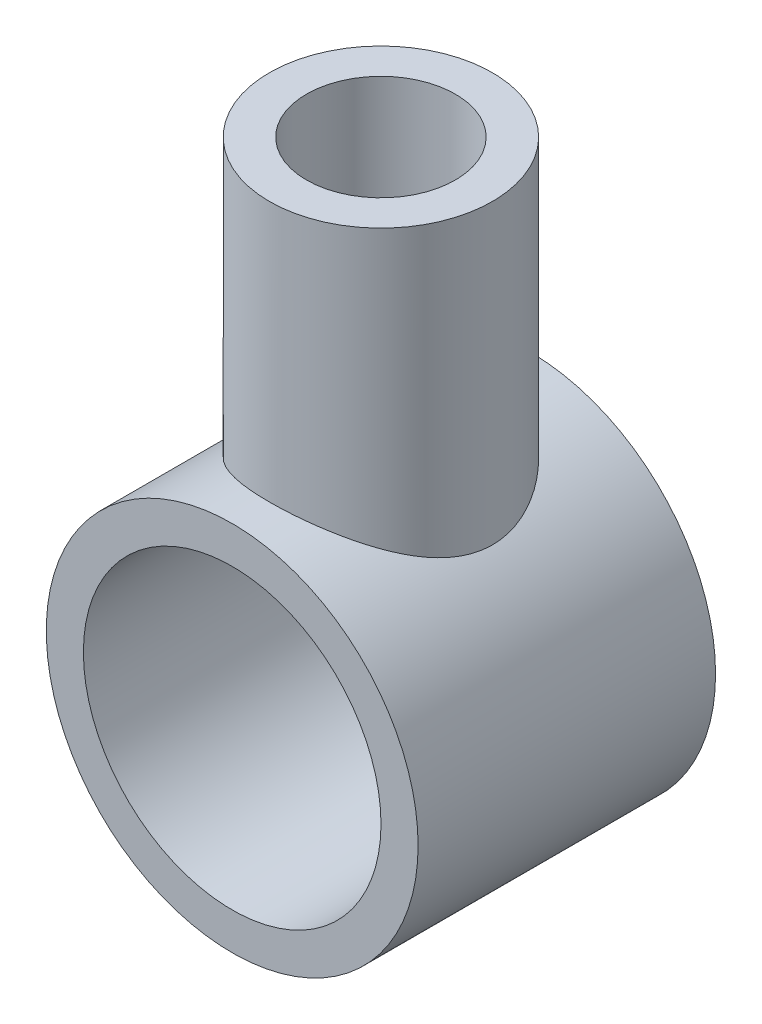
ISO-10303-21;
HEADER;
FILE_DESCRIPTION(('STEP AP214'),'2;1');
FILE_NAME('part.step','',(''),(''),'','','');
FILE_SCHEMA(('AUTOMOTIVE_DESIGN { 1 0 10303 214 1 1 1 1 }'));
ENDSEC;
DATA;
#1=APPLICATION_CONTEXT('core data for automotive mechanical design processes');
#2=APPLICATION_PROTOCOL_DEFINITION('international standard','automotive_design',2000,#1);
#3=PRODUCT_CONTEXT('',#1,'mechanical');
#4=PRODUCT('Part','Part','',(#3));
#5=PRODUCT_RELATED_PRODUCT_CATEGORY('part','',(#4));
#6=PRODUCT_DEFINITION_FORMATION('','',#4);
#7=PRODUCT_DEFINITION_CONTEXT('part definition',#1,'design');
#8=PRODUCT_DEFINITION('design','',#6,#7);
#9=PRODUCT_DEFINITION_SHAPE('','',#8);
#10=(LENGTH_UNIT() NAMED_UNIT(*) SI_UNIT(.MILLI.,.METRE.));
#11=(NAMED_UNIT(*) PLANE_ANGLE_UNIT() SI_UNIT($,.RADIAN.));
#12=(NAMED_UNIT(*) SI_UNIT($,.STERADIAN.) SOLID_ANGLE_UNIT());
#13=UNCERTAINTY_MEASURE_WITH_UNIT(LENGTH_MEASURE(1.E-05),#10,'distance_accuracy_value','');
#14=(GEOMETRIC_REPRESENTATION_CONTEXT(3) GLOBAL_UNCERTAINTY_ASSIGNED_CONTEXT((#13)) GLOBAL_UNIT_ASSIGNED_CONTEXT((#10,
#11,#12)) REPRESENTATION_CONTEXT('',''));
#15=CARTESIAN_POINT('',(0.,0.,0.));
#16=DIRECTION('',(0.,0.,1.));
#17=DIRECTION('',(1.,0.,0.));
#18=AXIS2_PLACEMENT_3D('',#15,#16,#17);
#19=CARTESIAN_POINT('',(0.,8.,0.));
#20=DIRECTION('',(0.,1.,0.));
#21=DIRECTION('',(0.,0.,1.));
#22=AXIS2_PLACEMENT_3D('',#19,#20,#21);
#23=CYLINDRICAL_SURFACE('',#22,7.5);
#24=CARTESIAN_POINT('',(0.,12.5,7.5));
#25=CARTESIAN_POINT('',(-0.191921798249075,12.4999985430848,7.4999984365452));
#26=CARTESIAN_POINT('',(-0.383892122899788,12.495568719545,7.4926217235484));
#27=CARTESIAN_POINT('',(-0.766384440440041,12.4779545373836,7.46320870674326));
#28=CARTESIAN_POINT('',(-0.956905519892443,12.4647650564379,7.44116382551773));
#29=CARTESIAN_POINT('',(-1.33530916589463,12.4299281923194,7.38265997105853));
#30=CARTESIAN_POINT('',(-1.52318603568261,12.4082647972337,7.3461737085066));
#31=CARTESIAN_POINT('',(-1.89465058940149,12.3570010567295,7.25924969570034));
#32=CARTESIAN_POINT('',(-2.07823640545608,12.3273973223774,7.20880598812313));
#33=CARTESIAN_POINT('',(-2.43886745755113,12.2611319880568,7.09489191572535));
#34=CARTESIAN_POINT('',(-2.6159428214286,12.2245096265528,7.03149384912067));
#35=CARTESIAN_POINT('',(-2.96367122518794,12.1448955180684,6.89215176190171));
#36=CARTESIAN_POINT('',(-3.13432175230714,12.1019013108445,6.81620289396865));
#37=CARTESIAN_POINT('',(-3.46819544185586,12.010476563191,6.6525300355252));
#38=CARTESIAN_POINT('',(-3.63142395541591,11.9620500295911,6.56481471460276));
#39=CARTESIAN_POINT('',(-3.94994870836128,11.860686768855,6.37824475964108));
#40=CARTESIAN_POINT('',(-4.10524199137912,11.8077483800879,6.27938601732933));
#41=CARTESIAN_POINT('',(-4.58131741026127,11.6353238707557,5.95124071938056));
#42=CARTESIAN_POINT('',(-4.88684096955477,11.5093751639425,5.70280170727025));
#43=CARTESIAN_POINT('',(-5.45449275250934,11.2514863605903,5.16259370663034));
#44=CARTESIAN_POINT('',(-5.71656443465284,11.1195387379384,4.87076918454309));
#45=CARTESIAN_POINT('',(-6.08852554673799,10.9180163482214,4.385004918194));
#46=CARTESIAN_POINT('',(-6.21477734351409,10.8464470278206,4.20421020936036));
#47=CARTESIAN_POINT('',(-6.45152832645234,10.7073160002908,3.83100607095131));
#48=CARTESIAN_POINT('',(-6.5620249109106,10.6397549561331,3.63859473053784));
#49=CARTESIAN_POINT('',(-6.7661342115073,10.5111356727963,3.24327815959601));
#50=CARTESIAN_POINT('',(-6.8597689753251,10.4500689853567,3.04038708543078));
#51=CARTESIAN_POINT('',(-7.02922716887086,10.3368448332123,2.62492721648551));
#52=CARTESIAN_POINT('',(-7.10505724548748,10.2846840457259,2.41236206874753));
#53=CARTESIAN_POINT('',(-7.22171525159989,10.2029701499711,2.03134991434493));
#54=CARTESIAN_POINT('',(-7.26657361433481,10.170999428992,1.86464582031261));
#55=CARTESIAN_POINT('',(-7.34487549643168,10.1146002637467,1.52733809633286));
#56=CARTESIAN_POINT('',(-7.37832154465844,10.0901701486656,1.35673533924529));
#57=CARTESIAN_POINT('',(-7.4333371356005,10.0497098691268,1.01281465482376));
#58=CARTESIAN_POINT('',(-7.45491888284421,10.033671073539,0.839499706980394));
#59=CARTESIAN_POINT('',(-7.48594080980444,10.0105478350572,0.491181188090445));
#60=CARTESIAN_POINT('',(-7.49538078052584,10.0034635462963,0.316177588029509));
#61=CARTESIAN_POINT('',(-7.50197496073536,9.99851937475401,-0.0345379480199738));
#62=CARTESIAN_POINT('',(-7.49910494673155,10.0006776794626,-0.210250600233947));
#63=CARTESIAN_POINT('',(-7.48107057297597,10.0141753404719,-0.560684804835286));
#64=CARTESIAN_POINT('',(-7.46590615348871,10.0255147413814,-0.735406352402964));
#65=CARTESIAN_POINT('',(-7.42350836347631,10.0569486368535,-1.08265177404497));
#66=CARTESIAN_POINT('',(-7.39626955113477,10.0770470789654,-1.25517462107758));
#67=CARTESIAN_POINT('',(-7.33009470718113,10.1252843642805,-1.5968765252855));
#68=CARTESIAN_POINT('',(-7.29115389512323,10.1534264932226,-1.76605418574034));
#69=CARTESIAN_POINT('',(-7.20265708143975,10.2163904933416,-2.09781029718825));
#70=CARTESIAN_POINT('',(-7.15325079644041,10.2511174961488,-2.26044688493025));
#71=CARTESIAN_POINT('',(-7.04401477425678,10.3264831977051,-2.58079782347778));
#72=CARTESIAN_POINT('',(-6.98418162996932,10.3671238280855,-2.73851054542555));
#73=CARTESIAN_POINT('',(-6.78980796262699,10.4963195413646,-3.20332035148076));
#74=CARTESIAN_POINT('',(-6.64034878491715,10.5921814170662,-3.5022531891579));
#75=CARTESIAN_POINT('',(-6.27585695706599,10.8127887017922,-4.12500181670132));
#76=CARTESIAN_POINT('',(-6.05392839343321,10.9396537492766,-4.44403084011634));
#77=CARTESIAN_POINT('',(-5.68696579774525,11.1322791458766,-4.893455340776));
#78=CARTESIAN_POINT('',(-5.55885445161762,11.1969264346314,-5.03851112930615));
#79=CARTESIAN_POINT('',(-5.29161750299653,11.3256679619548,-5.31847966716556));
#80=CARTESIAN_POINT('',(-5.15248994388979,11.389762100025,-5.45339060631267));
#81=CARTESIAN_POINT('',(-4.84352337052905,11.5248664959838,-5.73054671993657));
#82=CARTESIAN_POINT('',(-4.67210998155133,11.5955910064865,-5.87118061916403));
#83=CARTESIAN_POINT('',(-4.31642649606306,11.73263678734,-6.13740847381992));
#84=CARTESIAN_POINT('',(-4.13216143374951,11.7989597621921,-6.26300826655045));
#85=CARTESIAN_POINT('',(-3.75162576050857,11.9254137704905,-6.49810059921581));
#86=CARTESIAN_POINT('',(-3.55535657576306,11.9855455372307,-6.60759504734648));
#87=CARTESIAN_POINT('',(-3.15194729181295,12.0978943091234,-6.80926281254276));
#88=CARTESIAN_POINT('',(-2.94480854595885,12.1501122964741,-6.9014382794498));
#89=CARTESIAN_POINT('',(-2.53446597837191,12.2420531904365,-7.06200527309797));
#90=CARTESIAN_POINT('',(-2.33183564416586,12.2823558347346,-7.13152893383911));
#91=CARTESIAN_POINT('',(-1.91980902565829,12.3534619435042,-7.25330744348383));
#92=CARTESIAN_POINT('',(-1.7104129357343,12.3842656806081,-7.30556278801598));
#93=CARTESIAN_POINT('',(-1.2868671133641,12.4354102309757,-7.39193061580728));
#94=CARTESIAN_POINT('',(-1.07272234173071,12.4557614718837,-7.42606118191001));
#95=CARTESIAN_POINT('',(-0.641532882527487,12.4853958595801,-7.47566116926035));
#96=CARTESIAN_POINT('',(-0.42448860716829,12.4946805630715,-7.49113321516023));
#97=CARTESIAN_POINT('',(-0.0192857373427629,12.5013977077804,-7.50232977522586));
#98=CARTESIAN_POINT('',(0.168787906819913,12.5002700025031,-7.50045324245976));
#99=CARTESIAN_POINT('',(0.544022837371167,12.4895659482121,-7.48260054652061));
#100=CARTESIAN_POINT('',(0.731184153662327,12.479989878001,-7.46662484863094));
#101=CARTESIAN_POINT('',(1.10317007072558,12.4526221910751,-7.42079079621312));
#102=CARTESIAN_POINT('',(1.2879948301185,12.4348311351581,-7.39093338932165));
#103=CARTESIAN_POINT('',(1.65401559026168,12.3914568412352,-7.31772306484416));
#104=CARTESIAN_POINT('',(1.83521150079451,12.3658734097574,-7.2743698121778));
#105=CARTESIAN_POINT('',(2.18839848057125,12.3082138672793,-7.17590990399207));
#106=CARTESIAN_POINT('',(2.36050634038211,12.2763130658077,-7.12111881049711));
#107=CARTESIAN_POINT('',(2.69923714475605,12.2063133435245,-6.99975212191653));
#108=CARTESIAN_POINT('',(2.86585827724116,12.1682123992206,-6.93317267893232));
#109=CARTESIAN_POINT('',(3.35615670056769,12.0457213774797,-6.7166709449118));
#110=CARTESIAN_POINT('',(3.67052857953987,11.9530990642683,-6.54991190080987));
#111=CARTESIAN_POINT('',(4.30007661818615,11.7422712412733,-6.15720610000068));
#112=CARTESIAN_POINT('',(4.61195177067363,11.6224084145975,-5.9269134196076));
#113=CARTESIAN_POINT('',(5.19514916038812,11.3736949797305,-5.42301042942474));
#114=CARTESIAN_POINT('',(5.46642348377073,11.244834011477,-5.14934971179925));
#115=CARTESIAN_POINT('',(5.85595925215204,11.0445862325777,-4.69094842241578));
#116=CARTESIAN_POINT('',(5.98949987091459,10.9725486475353,-4.51922027566205));
#117=CARTESIAN_POINT('',(6.24166951399244,10.8310862666038,-4.16401042900029));
#118=CARTESIAN_POINT('',(6.36029613825264,10.7616618925054,-3.98052684448601));
#119=CARTESIAN_POINT('',(6.58166034767794,10.6277224441709,-3.60272854677959));
#120=CARTESIAN_POINT('',(6.6844108768127,10.5632033926025,-3.40842283474379));
#121=CARTESIAN_POINT('',(6.87316150637667,10.4413730391475,-3.0096945758837));
#122=CARTESIAN_POINT('',(6.9591669194731,10.384059453258,-2.80527526366553));
#123=CARTESIAN_POINT('',(7.09670733690346,10.2903886001255,-2.4325394381496));
#124=CARTESIAN_POINT('',(7.15167592789611,10.2521778702183,-2.26594943752882));
#125=CARTESIAN_POINT('',(7.25007474176706,10.1828307583145,-1.92804360893722));
#126=CARTESIAN_POINT('',(7.29351197913285,10.1516900773056,-1.75673072422112));
#127=CARTESIAN_POINT('',(7.36832111025433,10.0975234987595,-1.41038949652468));
#128=CARTESIAN_POINT('',(7.39970439360498,10.0744899426549,-1.23536482661822));
#129=CARTESIAN_POINT('',(7.4500192164785,10.0373401260548,-0.882584347500492));
#130=CARTESIAN_POINT('',(7.46895068330038,10.0232239176239,-0.704828522349341));
#131=CARTESIAN_POINT('',(7.49410941763376,10.0044277781433,-0.347232721104311));
#132=CARTESIAN_POINT('',(7.50028796895909,9.99978403272812,-0.167387382538947));
#133=CARTESIAN_POINT('',(7.4996913934028,10.0002314458485,0.192269679825566));
#134=CARTESIAN_POINT('',(7.49291624375474,10.0053226214934,0.372081403565081));
#135=CARTESIAN_POINT('',(7.46651992888389,10.0250360720896,0.730311179188335));
#136=CARTESIAN_POINT('',(7.44689265433152,10.0396628798425,0.90872852741109));
#137=CARTESIAN_POINT('',(7.39509814055963,10.0778744757253,1.26274775486685));
#138=CARTESIAN_POINT('',(7.36293084955999,10.1014593008446,1.43834962247109));
#139=CARTESIAN_POINT('',(7.28836911749912,10.1553769584842,1.77715710097497));
#140=CARTESIAN_POINT('',(7.2465470097527,10.1853265945128,1.94055064426202));
#141=CARTESIAN_POINT('',(7.15242187978739,10.2516422345012,2.26298298019979));
#142=CARTESIAN_POINT('',(7.1001153229581,10.2880104018376,2.42202028362828));
#143=CARTESIAN_POINT('',(6.92820928331201,10.4052481520199,2.89152833628017));
#144=CARTESIAN_POINT('',(6.79358492971536,10.4942801152033,3.19456722388378));
#145=CARTESIAN_POINT('',(6.46442680632607,10.7006683725987,3.82167866173841));
#146=CARTESIAN_POINT('',(6.26386838464329,10.8202746906701,4.1418372396271));
#147=CARTESIAN_POINT('',(5.93010763492978,11.0045480960382,4.59555706125437));
#148=CARTESIAN_POINT('',(5.81327497944236,11.0668278174544,4.74246940446227));
#149=CARTESIAN_POINT('',(5.56897167650257,11.1917539221139,5.02709870573982));
#150=CARTESIAN_POINT('',(5.44149931057837,11.2544003630625,5.1648141718856));
#151=CARTESIAN_POINT('',(5.15466237430539,11.3889636105884,5.45226181410206));
#152=CARTESIAN_POINT('',(4.99349255665734,11.4607197197764,5.60027221007155));
#153=CARTESIAN_POINT('',(4.65807777425059,11.6010926580952,5.88220096235632));
#154=CARTESIAN_POINT('',(4.48383683186237,11.6697104426032,6.01612362365556));
#155=CARTESIAN_POINT('',(4.12286082183188,11.80207592976,6.26902006758606));
#156=CARTESIAN_POINT('',(3.9361169924581,11.8658201486847,6.38798319528622));
#157=CARTESIAN_POINT('',(3.55120509036437,11.9866432048469,6.6097092165058));
#158=CARTESIAN_POINT('',(3.3530384523715,12.0437228764517,6.7124741385226));
#159=CARTESIAN_POINT('',(2.952642030505,12.1479788910382,6.89775877768167));
#160=CARTESIAN_POINT('',(2.75071786522497,12.195403129165,6.98079807428311));
#161=CARTESIAN_POINT('',(2.33867528824146,12.2810769556124,7.12941373623336));
#162=CARTESIAN_POINT('',(2.12855845740477,12.3193283038591,7.19499345167298));
#163=CARTESIAN_POINT('',(1.70250799550625,12.3853864335246,7.30752116731637));
#164=CARTESIAN_POINT('',(1.48659472546369,12.4132256689102,7.35452708731223));
#165=CARTESIAN_POINT('',(1.05045839192144,12.4577084026555,7.42936149374829));
#166=CARTESIAN_POINT('',(0.830239075623945,12.4743612252339,7.45720595232956));
#167=CARTESIAN_POINT('',(0.507810026068092,12.4900932187085,7.48347921548552));
#168=CARTESIAN_POINT('',(0.406391087679503,12.4938050696703,7.4896712202708));
#169=CARTESIAN_POINT('',(0.203319310557774,12.4987588890391,7.49793209814404));
#170=CARTESIAN_POINT('',(0.101666463833427,12.5000007717697,7.50000082820671));
#171=CARTESIAN_POINT('',(0.,12.5,7.5));
#172=B_SPLINE_CURVE_WITH_KNOTS('',3,(#24,#25,#26,#27,#28,#29,#30,#31,#32,#33,#34,#35,#36,#37,
#38,#39,#40,#41,#42,#43,#44,#45,#46,#47,#48,#49,#50,#51,#52,#53,#54,#55,#56,#57,#58,#59,#60,#61,
#62,#63,#64,#65,#66,#67,#68,#69,#70,#71,#72,#73,#74,#75,#76,#77,#78,#79,#80,#81,#82,#83,#84,#85,
#86,#87,#88,#89,#90,#91,#92,#93,#94,#95,#96,#97,#98,#99,#100,#101,#102,#103,#104,#105,#106,#107,
#108,#109,#110,#111,#112,#113,#114,#115,#116,#117,#118,#119,#120,#121,#122,#123,#124,#125,#126,
#127,#128,#129,#130,#131,#132,#133,#134,#135,#136,#137,#138,#139,#140,#141,#142,#143,#144,#145,
#146,#147,#148,#149,#150,#151,#152,#153,#154,#155,#156,#157,#158,#159,#160,#161,#162,#163,#164,
#165,#166,#167,#168,#169,#170,#171),.UNSPECIFIED.,.T.,.F.,(4,2,2,2,2,2,2,2,2,2,2,2,2,2,2,2,2,2,
2,2,2,2,2,2,2,2,2,2,2,2,2,2,2,2,2,2,2,2,2,2,2,2,2,2,2,2,2,2,2,2,2,2,2,2,2,2,2,2,2,2,2,2,2,2,2,2,
2,2,2,2,2,2,2,4),(0.,0.575658251432628,1.15165342329302,1.72874226752964,2.30607780605299,
2.88027517438834,3.45469482738884,4.02869354596306,4.60290457849094,5.83804312511721,
7.07477648520982,7.76955587953221,8.46444987224585,9.15842855221241,9.85214774099053,
10.3783317787415,10.9043991430731,11.4299243367612,11.9554585761377,12.4820274316384,
13.008598845623,13.5354078221113,14.0624323013587,14.5823729181604,15.1024837515522,
16.1421908624219,17.3636701331933,17.9753557490457,18.5871502524504,19.2844715447335,
19.981521203304,20.6784882072916,21.3753686380633,22.0283690622014,22.6813507425443,
23.3336797222005,23.985916929492,24.5494725537166,25.1130095808644,25.6765081437307,
26.240020698484,26.7896630265487,27.3394850981962,28.4383180966588,29.6511641046257,
30.8654303177994,31.5522303880447,32.239140841448,32.9254882592785,33.6116175658354,
34.1497096204572,34.6874736013784,35.224728200012,35.7619859354243,36.3012922274808,
36.8405994673822,37.3801632562889,37.9197292731809,38.4331000236811,38.9466441382574,
39.9732017979046,41.1573697243671,41.7502714042648,42.3432690326204,43.033312738528,
43.7231449618982,44.4134657684988,45.1037000575925,45.7729957591089,46.442162945515,
47.109226640598,47.7757336253699,48.0806656829064,48.3856083175296),.UNSPECIFIED.);
#173=CARTESIAN_POINT('',(0.,12.5,7.5));
#174=VERTEX_POINT('',#173);
#175=EDGE_CURVE('E10',#174,#174,#172,.T.);
#176=ORIENTED_EDGE('',*,*,#175,.F.);
#177=EDGE_LOOP('',(#176));
#178=FACE_BOUND('',#177,.T.);
#179=CARTESIAN_POINT('',(0.,30.,0.));
#180=DIRECTION('',(0.,1.,0.));
#181=DIRECTION('',(0.,0.,1.));
#182=AXIS2_PLACEMENT_3D('',#179,#180,#181);
#183=CIRCLE('',#182,7.5);
#184=CARTESIAN_POINT('',(0.,30.,7.5));
#185=VERTEX_POINT('',#184);
#186=EDGE_CURVE('E38',#185,#185,#183,.T.);
#187=ORIENTED_EDGE('',*,*,#186,.F.);
#188=EDGE_LOOP('',(#187));
#189=FACE_BOUND('',#188,.T.);
#190=ADVANCED_FACE('F30',(#178,#189),#23,.T.);
#191=CARTESIAN_POINT('',(0.,30.,0.));
#192=DIRECTION('',(0.,1.,0.));
#193=DIRECTION('',(0.,0.,1.));
#194=AXIS2_PLACEMENT_3D('',#191,#192,#193);
#195=PLANE('',#194);
#196=CARTESIAN_POINT('',(0.,30.,0.));
#197=DIRECTION('',(0.,1.,0.));
#198=DIRECTION('',(0.,0.,1.));
#199=AXIS2_PLACEMENT_3D('',#196,#197,#198);
#200=CIRCLE('',#199,5.005);
#201=CARTESIAN_POINT('',(0.,30.,5.005));
#202=VERTEX_POINT('',#201);
#203=EDGE_CURVE('E65',#202,#202,#200,.T.);
#204=ORIENTED_EDGE('',*,*,#203,.F.);
#205=EDGE_LOOP('',(#204));
#206=FACE_BOUND('',#205,.T.);
#207=ORIENTED_EDGE('',*,*,#186,.T.);
#208=EDGE_LOOP('',(#207));
#209=FACE_BOUND('',#208,.T.);
#210=ADVANCED_FACE('F54',(#206,#209),#195,.T.);
#211=CARTESIAN_POINT('',(0.,0.,-9.99999999999999));
#212=DIRECTION('',(0.,0.,1.));
#213=DIRECTION('',(1.,0.,0.));
#214=AXIS2_PLACEMENT_3D('',#211,#212,#213);
#215=CYLINDRICAL_SURFACE('',#214,12.5);
#216=ORIENTED_EDGE('',*,*,#175,.T.);
#217=EDGE_LOOP('',(#216));
#218=FACE_BOUND('',#217,.T.);
#219=CARTESIAN_POINT('',(0.,0.,-9.99999999999999));
#220=DIRECTION('',(0.,0.,1.));
#221=DIRECTION('',(1.,0.,0.));
#222=AXIS2_PLACEMENT_3D('',#219,#220,#221);
#223=CIRCLE('',#222,12.5);
#224=CARTESIAN_POINT('',(12.5,0.,-9.99999999999999));
#225=VERTEX_POINT('',#224);
#226=EDGE_CURVE('E42',#225,#225,#223,.T.);
#227=ORIENTED_EDGE('',*,*,#226,.T.);
#228=EDGE_LOOP('',(#227));
#229=FACE_BOUND('',#228,.T.);
#230=CARTESIAN_POINT('',(0.,0.,10.));
#231=DIRECTION('',(0.,0.,1.));
#232=DIRECTION('',(1.,0.,0.));
#233=AXIS2_PLACEMENT_3D('',#230,#231,#232);
#234=CIRCLE('',#233,12.5);
#235=CARTESIAN_POINT('',(12.5,0.,10.));
#236=VERTEX_POINT('',#235);
#237=EDGE_CURVE('E77',#236,#236,#234,.T.);
#238=ORIENTED_EDGE('',*,*,#237,.F.);
#239=EDGE_LOOP('',(#238));
#240=FACE_BOUND('',#239,.T.);
#241=ADVANCED_FACE('F49',(#218,#229,#240),#215,.T.);
#242=CARTESIAN_POINT('',(0.,0.,-9.99999999999999));
#243=DIRECTION('',(0.,0.,1.));
#244=DIRECTION('',(1.,0.,0.));
#245=AXIS2_PLACEMENT_3D('',#242,#243,#244);
#246=PLANE('',#245);
#247=CARTESIAN_POINT('',(0.,0.,-9.99999999999999));
#248=DIRECTION('',(0.,0.,-1.));
#249=DIRECTION('',(-1.,0.,0.));
#250=AXIS2_PLACEMENT_3D('',#247,#248,#249);
#251=CIRCLE('',#250,10.005);
#252=CARTESIAN_POINT('',(-10.005,0.,-9.99999999999999));
#253=VERTEX_POINT('',#252);
#254=EDGE_CURVE('E72',#253,#253,#251,.T.);
#255=ORIENTED_EDGE('',*,*,#254,.F.);
#256=EDGE_LOOP('',(#255));
#257=FACE_BOUND('',#256,.T.);
#258=ORIENTED_EDGE('',*,*,#226,.F.);
#259=EDGE_LOOP('',(#258));
#260=FACE_BOUND('',#259,.T.);
#261=ADVANCED_FACE('F53',(#257,#260),#246,.F.);
#262=CARTESIAN_POINT('',(0.,0.,10.));
#263=DIRECTION('',(0.,0.,1.));
#264=DIRECTION('',(1.,0.,0.));
#265=AXIS2_PLACEMENT_3D('',#262,#263,#264);
#266=PLANE('',#265);
#267=CARTESIAN_POINT('',(0.,0.,10.));
#268=DIRECTION('',(0.,0.,1.));
#269=DIRECTION('',(1.,0.,0.));
#270=AXIS2_PLACEMENT_3D('',#267,#268,#269);
#271=CIRCLE('',#270,10.005);
#272=CARTESIAN_POINT('',(10.005,0.,10.));
#273=VERTEX_POINT('',#272);
#274=EDGE_CURVE('E34',#273,#273,#271,.T.);
#275=ORIENTED_EDGE('',*,*,#274,.F.);
#276=EDGE_LOOP('',(#275));
#277=FACE_BOUND('',#276,.T.);
#278=ORIENTED_EDGE('',*,*,#237,.T.);
#279=EDGE_LOOP('',(#278));
#280=FACE_BOUND('',#279,.T.);
#281=ADVANCED_FACE('F85',(#277,#280),#266,.T.);
#282=CARTESIAN_POINT('',(0.,0.,39.));
#283=DIRECTION('',(0.,0.,-1.));
#284=DIRECTION('',(-1.,0.,0.));
#285=AXIS2_PLACEMENT_3D('',#282,#283,#284);
#286=CYLINDRICAL_SURFACE('',#285,10.005);
#287=ORIENTED_EDGE('',*,*,#274,.T.);
#288=EDGE_LOOP('',(#287));
#289=FACE_BOUND('',#288,.T.);
#290=ORIENTED_EDGE('',*,*,#254,.T.);
#291=EDGE_LOOP('',(#290));
#292=FACE_BOUND('',#291,.T.);
#293=ADVANCED_FACE('F90',(#289,#292),#286,.F.);
#294=CARTESIAN_POINT('',(0.,15.,0.));
#295=DIRECTION('',(0.,1.,0.));
#296=DIRECTION('',(0.,0.,1.));
#297=AXIS2_PLACEMENT_3D('',#294,#295,#296);
#298=CYLINDRICAL_SURFACE('',#297,5.005);
#299=CARTESIAN_POINT('',(0.,15.,0.));
#300=DIRECTION('',(0.,1.,0.));
#301=DIRECTION('',(0.,0.,1.));
#302=AXIS2_PLACEMENT_3D('',#299,#300,#301);
#303=CIRCLE('',#302,5.005);
#304=CARTESIAN_POINT('',(0.,15.,5.005));
#305=VERTEX_POINT('',#304);
#306=EDGE_CURVE('E69',#305,#305,#303,.T.);
#307=ORIENTED_EDGE('',*,*,#306,.F.);
#308=EDGE_LOOP('',(#307));
#309=FACE_BOUND('',#308,.T.);
#310=ORIENTED_EDGE('',*,*,#203,.T.);
#311=EDGE_LOOP('',(#310));
#312=FACE_BOUND('',#311,.T.);
#313=ADVANCED_FACE('F95',(#309,#312),#298,.F.);
#314=CARTESIAN_POINT('',(0.,15.,0.));
#315=DIRECTION('',(0.,1.,0.));
#316=DIRECTION('',(0.,0.,1.));
#317=AXIS2_PLACEMENT_3D('',#314,#315,#316);
#318=PLANE('',#317);
#319=ORIENTED_EDGE('',*,*,#306,.T.);
#320=EDGE_LOOP('',(#319));
#321=FACE_BOUND('',#320,.T.);
#322=ADVANCED_FACE('F101',(#321),#318,.T.);
#323=CLOSED_SHELL('',(#190,#210,#241,#261,#281,#293,#313,#322));
#324=MANIFOLD_SOLID_BREP('B2',#323);
#325=ADVANCED_BREP_SHAPE_REPRESENTATION('',(#18,#324),#14);
#326=SHAPE_DEFINITION_REPRESENTATION(#9,#325);
ENDSEC;
END-ISO-10303-21;
